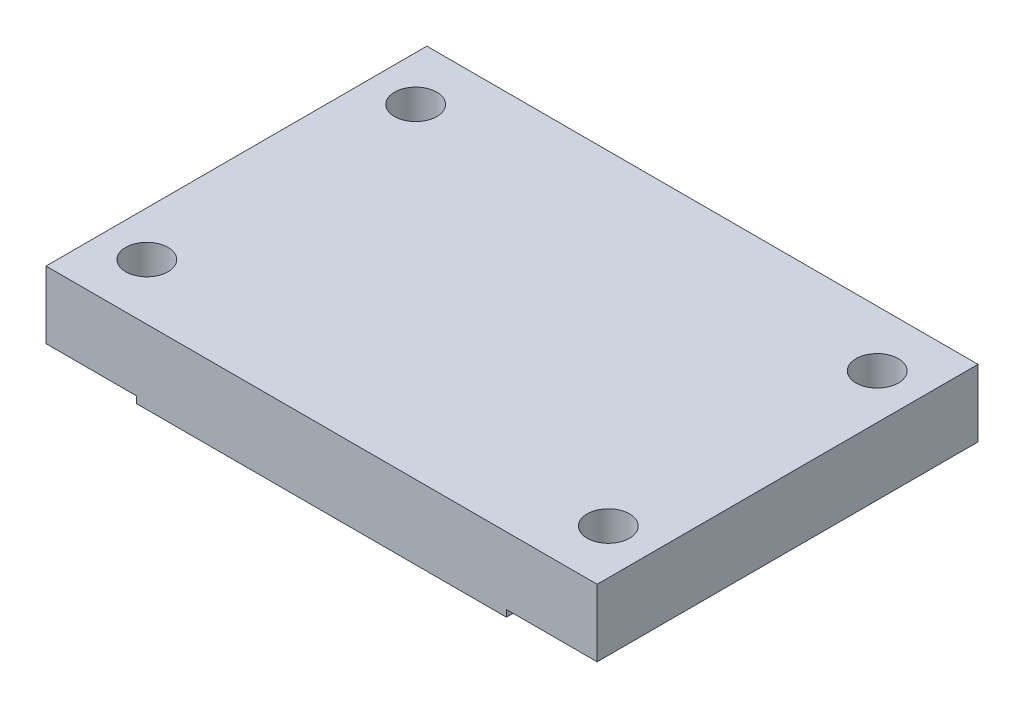
ISO-10303-21;
HEADER;
FILE_DESCRIPTION(('STEP AP214'),'2;1');
FILE_NAME('part.step','',(''),(''),'','','');
FILE_SCHEMA(('AUTOMOTIVE_DESIGN { 1 0 10303 214 1 1 1 1 }'));
ENDSEC;
DATA;
#1=APPLICATION_CONTEXT('core data for automotive mechanical design processes');
#2=APPLICATION_PROTOCOL_DEFINITION('international standard','automotive_design',2000,#1);
#3=PRODUCT_CONTEXT('',#1,'mechanical');
#4=PRODUCT('Part','Part','',(#3));
#5=PRODUCT_RELATED_PRODUCT_CATEGORY('part','',(#4));
#6=PRODUCT_DEFINITION_FORMATION('','',#4);
#7=PRODUCT_DEFINITION_CONTEXT('part definition',#1,'design');
#8=PRODUCT_DEFINITION('design','',#6,#7);
#9=PRODUCT_DEFINITION_SHAPE('','',#8);
#10=(LENGTH_UNIT() NAMED_UNIT(*) SI_UNIT(.MILLI.,.METRE.));
#11=(NAMED_UNIT(*) PLANE_ANGLE_UNIT() SI_UNIT($,.RADIAN.));
#12=(NAMED_UNIT(*) SI_UNIT($,.STERADIAN.) SOLID_ANGLE_UNIT());
#13=UNCERTAINTY_MEASURE_WITH_UNIT(LENGTH_MEASURE(1.E-05),#10,'distance_accuracy_value','');
#14=(GEOMETRIC_REPRESENTATION_CONTEXT(3) GLOBAL_UNCERTAINTY_ASSIGNED_CONTEXT((#13)) GLOBAL_UNIT_ASSIGNED_CONTEXT((#10,
#11,#12)) REPRESENTATION_CONTEXT('',''));
#15=CARTESIAN_POINT('',(0.,0.,0.));
#16=DIRECTION('',(0.,0.,1.));
#17=DIRECTION('',(1.,0.,0.));
#18=AXIS2_PLACEMENT_3D('',#15,#16,#17);
#19=CARTESIAN_POINT('',(0.,7.62,0.));
#20=DIRECTION('',(0.,-1.,0.));
#21=DIRECTION('',(0.,0.,-1.));
#22=AXIS2_PLACEMENT_3D('',#19,#20,#21);
#23=PLANE('',#22);
#24=DIRECTION('',(0.,0.,-1.));
#25=VECTOR('',#24,1.);
#26=CARTESIAN_POINT('',(31.242,7.62,21.5037006243539));
#27=LINE('',#26,#25);
#28=CARTESIAN_POINT('',(31.242,7.62,21.5037006243539));
#29=VERTEX_POINT('',#28);
#30=CARTESIAN_POINT('',(31.242,7.62,-21.6762993756461));
#31=VERTEX_POINT('',#30);
#32=EDGE_CURVE('E176',#29,#31,#27,.T.);
#33=ORIENTED_EDGE('',*,*,#32,.T.);
#34=DIRECTION('',(-1.,0.,0.));
#35=VECTOR('',#34,1.);
#36=CARTESIAN_POINT('',(-31.242,7.62,-21.6762993756461));
#37=LINE('',#36,#35);
#38=CARTESIAN_POINT('',(-31.242,7.62,-21.6762993756461));
#39=VERTEX_POINT('',#38);
#40=EDGE_CURVE('E180',#31,#39,#37,.T.);
#41=ORIENTED_EDGE('',*,*,#40,.T.);
#42=DIRECTION('',(0.,0.,1.));
#43=VECTOR('',#42,1.);
#44=CARTESIAN_POINT('',(-31.242,7.62,21.5037006243539));
#45=LINE('',#44,#43);
#46=CARTESIAN_POINT('',(-31.242,7.62,21.5037006243539));
#47=VERTEX_POINT('',#46);
#48=EDGE_CURVE('E184',#39,#47,#45,.T.);
#49=ORIENTED_EDGE('',*,*,#48,.T.);
#50=DIRECTION('',(1.,0.,0.));
#51=VECTOR('',#50,1.);
#52=CARTESIAN_POINT('',(-31.242,7.62,21.5037006243539));
#53=LINE('',#52,#51);
#54=EDGE_CURVE('E187',#47,#29,#53,.T.);
#55=ORIENTED_EDGE('',*,*,#54,.T.);
#56=EDGE_LOOP('',(#33,#41,#49,#55));
#57=FACE_BOUND('',#56,.T.);
#58=CARTESIAN_POINT('',(-26.162,7.62,-15.3262993756461));
#59=DIRECTION('',(0.,1.,0.));
#60=DIRECTION('',(0.,0.,1.));
#61=AXIS2_PLACEMENT_3D('',#58,#59,#60);
#62=CIRCLE('',#61,2.4003);
#63=CARTESIAN_POINT('',(-26.162,7.62,-17.7265993756461));
#64=VERTEX_POINT('',#63);
#65=EDGE_CURVE('E168',#64,#64,#62,.T.);
#66=ORIENTED_EDGE('',*,*,#65,.F.);
#67=EDGE_LOOP('',(#66));
#68=FACE_BOUND('',#67,.T.);
#69=CARTESIAN_POINT('',(-26.162,7.62,15.1537006243539));
#70=DIRECTION('',(0.,1.,0.));
#71=DIRECTION('',(0.,0.,1.));
#72=AXIS2_PLACEMENT_3D('',#69,#70,#71);
#73=CIRCLE('',#72,2.4003);
#74=CARTESIAN_POINT('',(-26.162,7.62,12.7534006243539));
#75=VERTEX_POINT('',#74);
#76=EDGE_CURVE('E160',#75,#75,#73,.T.);
#77=ORIENTED_EDGE('',*,*,#76,.F.);
#78=EDGE_LOOP('',(#77));
#79=FACE_BOUND('',#78,.T.);
#80=CARTESIAN_POINT('',(26.162,7.62,15.1537006243539));
#81=DIRECTION('',(0.,1.,0.));
#82=DIRECTION('',(0.,0.,-1.));
#83=AXIS2_PLACEMENT_3D('',#80,#81,#82);
#84=CIRCLE('',#83,2.4003);
#85=CARTESIAN_POINT('',(26.162,7.62,12.7534006243539));
#86=VERTEX_POINT('',#85);
#87=EDGE_CURVE('E152',#86,#86,#84,.T.);
#88=ORIENTED_EDGE('',*,*,#87,.F.);
#89=EDGE_LOOP('',(#88));
#90=FACE_BOUND('',#89,.T.);
#91=CARTESIAN_POINT('',(26.162,7.62,-15.3262993756461));
#92=DIRECTION('',(0.,1.,0.));
#93=DIRECTION('',(0.,0.,-1.));
#94=AXIS2_PLACEMENT_3D('',#91,#92,#93);
#95=CIRCLE('',#94,2.4003);
#96=CARTESIAN_POINT('',(26.162,7.62,-17.7265993756461));
#97=VERTEX_POINT('',#96);
#98=EDGE_CURVE('E142',#97,#97,#95,.T.);
#99=ORIENTED_EDGE('',*,*,#98,.F.);
#100=EDGE_LOOP('',(#99));
#101=FACE_BOUND('',#100,.T.);
#102=ADVANCED_FACE('F47',(#57,#68,#79,#90,#101),#23,.F.);
#103=CARTESIAN_POINT('',(0.,0.,0.));
#104=DIRECTION('',(0.,-1.,0.));
#105=DIRECTION('',(0.,0.,-1.));
#106=AXIS2_PLACEMENT_3D('',#103,#104,#105);
#107=PLANE('',#106);
#108=DIRECTION('',(0.,0.,1.));
#109=VECTOR('',#108,1.);
#110=CARTESIAN_POINT('',(20.955,0.,-21.5037006243539));
#111=LINE('',#110,#109);
#112=CARTESIAN_POINT('',(20.955,0.,-21.5037006243539));
#113=VERTEX_POINT('',#112);
#114=CARTESIAN_POINT('',(20.955,0.,21.5037006243539));
#115=VERTEX_POINT('',#114);
#116=EDGE_CURVE('E63',#113,#115,#111,.T.);
#117=ORIENTED_EDGE('',*,*,#116,.F.);
#118=DIRECTION('',(1.,0.,0.));
#119=VECTOR('',#118,1.);
#120=CARTESIAN_POINT('',(-20.955,0.,-21.5037006243539));
#121=LINE('',#120,#119);
#122=CARTESIAN_POINT('',(-20.955,0.,-21.5037006243539));
#123=VERTEX_POINT('',#122);
#124=EDGE_CURVE('E133',#123,#113,#121,.T.);
#125=ORIENTED_EDGE('',*,*,#124,.F.);
#126=DIRECTION('',(0.,0.,-1.));
#127=VECTOR('',#126,1.);
#128=CARTESIAN_POINT('',(-20.955,0.,-21.5037006243539));
#129=LINE('',#128,#127);
#130=CARTESIAN_POINT('',(-20.955,0.,21.5037006243539));
#131=VERTEX_POINT('',#130);
#132=EDGE_CURVE('E221',#131,#123,#129,.T.);
#133=ORIENTED_EDGE('',*,*,#132,.F.);
#134=DIRECTION('',(1.,0.,0.));
#135=VECTOR('',#134,1.);
#136=CARTESIAN_POINT('',(-31.242,0.,21.5037006243539));
#137=LINE('',#136,#135);
#138=CARTESIAN_POINT('',(-31.242,0.,21.5037006243539));
#139=VERTEX_POINT('',#138);
#140=EDGE_CURVE('E181',#139,#131,#137,.T.);
#141=ORIENTED_EDGE('',*,*,#140,.F.);
#142=DIRECTION('',(0.,0.,1.));
#143=VECTOR('',#142,1.);
#144=CARTESIAN_POINT('',(-31.242,0.,21.5037006243539));
#145=LINE('',#144,#143);
#146=CARTESIAN_POINT('',(-31.242,0.,-21.6762993756461));
#147=VERTEX_POINT('',#146);
#148=EDGE_CURVE('E197',#147,#139,#145,.T.);
#149=ORIENTED_EDGE('',*,*,#148,.F.);
#150=DIRECTION('',(-1.,0.,0.));
#151=VECTOR('',#150,1.);
#152=CARTESIAN_POINT('',(-31.242,0.,-21.6762993756461));
#153=LINE('',#152,#151);
#154=CARTESIAN_POINT('',(31.242,0.,-21.6762993756461));
#155=VERTEX_POINT('',#154);
#156=EDGE_CURVE('E194',#155,#147,#153,.T.);
#157=ORIENTED_EDGE('',*,*,#156,.F.);
#158=DIRECTION('',(0.,0.,-1.));
#159=VECTOR('',#158,1.);
#160=CARTESIAN_POINT('',(31.242,0.,21.5037006243539));
#161=LINE('',#160,#159);
#162=CARTESIAN_POINT('',(31.242,0.,21.5037006243539));
#163=VERTEX_POINT('',#162);
#164=EDGE_CURVE('E172',#163,#155,#161,.T.);
#165=ORIENTED_EDGE('',*,*,#164,.F.);
#166=EDGE_CURVE('E68',#115,#163,#137,.T.);
#167=ORIENTED_EDGE('',*,*,#166,.F.);
#168=EDGE_LOOP('',(#117,#125,#133,#141,#149,#157,#165,#167));
#169=FACE_BOUND('',#168,.T.);
#170=CARTESIAN_POINT('',(26.162,0.,15.1537006243539));
#171=DIRECTION('',(0.,1.,0.));
#172=DIRECTION('',(0.,0.,-1.));
#173=AXIS2_PLACEMENT_3D('',#170,#171,#172);
#174=CIRCLE('',#173,2.4003);
#175=CARTESIAN_POINT('',(26.162,0.,12.7534006243539));
#176=VERTEX_POINT('',#175);
#177=EDGE_CURVE('E150',#176,#176,#174,.T.);
#178=ORIENTED_EDGE('',*,*,#177,.T.);
#179=EDGE_LOOP('',(#178));
#180=FACE_BOUND('',#179,.T.);
#181=CARTESIAN_POINT('',(-26.162,0.,-15.3262993756461));
#182=DIRECTION('',(0.,1.,0.));
#183=DIRECTION('',(0.,0.,1.));
#184=AXIS2_PLACEMENT_3D('',#181,#182,#183);
#185=CIRCLE('',#184,2.4003);
#186=CARTESIAN_POINT('',(-26.162,0.,-17.7265993756461));
#187=VERTEX_POINT('',#186);
#188=EDGE_CURVE('E164',#187,#187,#185,.T.);
#189=ORIENTED_EDGE('',*,*,#188,.T.);
#190=EDGE_LOOP('',(#189));
#191=FACE_BOUND('',#190,.T.);
#192=CARTESIAN_POINT('',(-26.162,0.,15.1537006243539));
#193=DIRECTION('',(0.,1.,0.));
#194=DIRECTION('',(0.,0.,1.));
#195=AXIS2_PLACEMENT_3D('',#192,#193,#194);
#196=CIRCLE('',#195,2.4003);
#197=CARTESIAN_POINT('',(-26.162,0.,12.7534006243539));
#198=VERTEX_POINT('',#197);
#199=EDGE_CURVE('E156',#198,#198,#196,.T.);
#200=ORIENTED_EDGE('',*,*,#199,.T.);
#201=EDGE_LOOP('',(#200));
#202=FACE_BOUND('',#201,.T.);
#203=CARTESIAN_POINT('',(26.162,0.,-15.3262993756461));
#204=DIRECTION('',(0.,1.,0.));
#205=DIRECTION('',(0.,0.,-1.));
#206=AXIS2_PLACEMENT_3D('',#203,#204,#205);
#207=CIRCLE('',#206,2.4003);
#208=CARTESIAN_POINT('',(26.162,0.,-17.7265993756461));
#209=VERTEX_POINT('',#208);
#210=EDGE_CURVE('E137',#209,#209,#207,.T.);
#211=ORIENTED_EDGE('',*,*,#210,.T.);
#212=EDGE_LOOP('',(#211));
#213=FACE_BOUND('',#212,.T.);
#214=ADVANCED_FACE('F218',(#169,#180,#191,#202,#213),#107,.T.);
#215=CARTESIAN_POINT('',(31.242,7.62,21.5037006243539));
#216=DIRECTION('',(-1.,0.,0.));
#217=DIRECTION('',(0.,0.,1.));
#218=AXIS2_PLACEMENT_3D('',#215,#216,#217);
#219=PLANE('',#218);
#220=ORIENTED_EDGE('',*,*,#164,.T.);
#221=DIRECTION('',(0.,-1.,0.));
#222=VECTOR('',#221,1.);
#223=CARTESIAN_POINT('',(31.242,7.62,-21.6762993756461));
#224=LINE('',#223,#222);
#225=EDGE_CURVE('E11',#31,#155,#224,.T.);
#226=ORIENTED_EDGE('',*,*,#225,.F.);
#227=ORIENTED_EDGE('',*,*,#32,.F.);
#228=DIRECTION('',(0.,-1.,0.));
#229=VECTOR('',#228,1.);
#230=CARTESIAN_POINT('',(31.242,7.62,21.5037006243539));
#231=LINE('',#230,#229);
#232=EDGE_CURVE('E190',#29,#163,#231,.T.);
#233=ORIENTED_EDGE('',*,*,#232,.T.);
#234=EDGE_LOOP('',(#220,#226,#227,#233));
#235=FACE_BOUND('',#234,.T.);
#236=ADVANCED_FACE('F49',(#235),#219,.F.);
#237=CARTESIAN_POINT('',(-31.242,7.62,-21.6762993756461));
#238=DIRECTION('',(0.,0.,1.));
#239=DIRECTION('',(1.,0.,0.));
#240=AXIS2_PLACEMENT_3D('',#237,#238,#239);
#241=PLANE('',#240);
#242=ORIENTED_EDGE('',*,*,#156,.T.);
#243=DIRECTION('',(0.,-1.,0.));
#244=VECTOR('',#243,1.);
#245=CARTESIAN_POINT('',(-31.242,7.62,-21.6762993756461));
#246=LINE('',#245,#244);
#247=EDGE_CURVE('E56',#39,#147,#246,.T.);
#248=ORIENTED_EDGE('',*,*,#247,.F.);
#249=ORIENTED_EDGE('',*,*,#40,.F.);
#250=ORIENTED_EDGE('',*,*,#225,.T.);
#251=EDGE_LOOP('',(#242,#248,#249,#250));
#252=FACE_BOUND('',#251,.T.);
#253=ADVANCED_FACE('F267',(#252),#241,.F.);
#254=CARTESIAN_POINT('',(-31.242,7.62,21.5037006243539));
#255=DIRECTION('',(1.,0.,0.));
#256=DIRECTION('',(0.,0.,-1.));
#257=AXIS2_PLACEMENT_3D('',#254,#255,#256);
#258=PLANE('',#257);
#259=ORIENTED_EDGE('',*,*,#148,.T.);
#260=DIRECTION('',(0.,-1.,0.));
#261=VECTOR('',#260,1.);
#262=CARTESIAN_POINT('',(-31.242,7.62,21.5037006243539));
#263=LINE('',#262,#261);
#264=EDGE_CURVE('E205',#47,#139,#263,.T.);
#265=ORIENTED_EDGE('',*,*,#264,.F.);
#266=ORIENTED_EDGE('',*,*,#48,.F.);
#267=ORIENTED_EDGE('',*,*,#247,.T.);
#268=EDGE_LOOP('',(#259,#265,#266,#267));
#269=FACE_BOUND('',#268,.T.);
#270=ADVANCED_FACE('F214',(#269),#258,.F.);
#271=CARTESIAN_POINT('',(-31.242,7.62,21.5037006243539));
#272=DIRECTION('',(0.,0.,-1.));
#273=DIRECTION('',(-1.,0.,0.));
#274=AXIS2_PLACEMENT_3D('',#271,#272,#273);
#275=PLANE('',#274);
#276=ORIENTED_EDGE('',*,*,#140,.T.);
#277=DIRECTION('',(0.,1.,0.));
#278=VECTOR('',#277,1.);
#279=CARTESIAN_POINT('',(-20.955,-0.762,21.5037006243539));
#280=LINE('',#279,#278);
#281=CARTESIAN_POINT('',(-20.955,-0.762,21.5037006243539));
#282=VERTEX_POINT('',#281);
#283=EDGE_CURVE('E118',#282,#131,#280,.T.);
#284=ORIENTED_EDGE('',*,*,#283,.F.);
#285=DIRECTION('',(-1.,0.,0.));
#286=VECTOR('',#285,1.);
#287=CARTESIAN_POINT('',(-20.955,-0.762,21.5037006243539));
#288=LINE('',#287,#286);
#289=CARTESIAN_POINT('',(20.955,-0.762,21.5037006243539));
#290=VERTEX_POINT('',#289);
#291=EDGE_CURVE('E111',#290,#282,#288,.T.);
#292=ORIENTED_EDGE('',*,*,#291,.F.);
#293=DIRECTION('',(0.,1.,0.));
#294=VECTOR('',#293,1.);
#295=CARTESIAN_POINT('',(20.955,-0.762,21.5037006243539));
#296=LINE('',#295,#294);
#297=EDGE_CURVE('E116',#290,#115,#296,.T.);
#298=ORIENTED_EDGE('',*,*,#297,.T.);
#299=ORIENTED_EDGE('',*,*,#166,.T.);
#300=ORIENTED_EDGE('',*,*,#232,.F.);
#301=ORIENTED_EDGE('',*,*,#54,.F.);
#302=ORIENTED_EDGE('',*,*,#264,.T.);
#303=EDGE_LOOP('',(#276,#284,#292,#298,#299,#300,#301,#302));
#304=FACE_BOUND('',#303,.T.);
#305=ADVANCED_FACE('F114',(#304),#275,.F.);
#306=CARTESIAN_POINT('',(-26.162,7.62,-15.3262993756461));
#307=DIRECTION('',(0.,-1.,0.));
#308=DIRECTION('',(0.,0.,-1.));
#309=AXIS2_PLACEMENT_3D('',#306,#307,#308);
#310=CYLINDRICAL_SURFACE('',#309,2.4003);
#311=CARTESIAN_POINT('',(-26.162,7.62,-17.7265993756461));
#312=CARTESIAN_POINT('',(-26.162,7.540625,-17.7265993756461));
#313=CARTESIAN_POINT('',(-26.162,7.46125,-17.7265993756461));
#314=CARTESIAN_POINT('',(-26.162,7.3025,-17.7265993756461));
#315=CARTESIAN_POINT('',(-26.162,7.223125,-17.7265993756461));
#316=CARTESIAN_POINT('',(-26.162,7.064375,-17.7265993756461));
#317=CARTESIAN_POINT('',(-26.162,6.985,-17.7265993756461));
#318=CARTESIAN_POINT('',(-26.162,6.82625,-17.7265993756461));
#319=CARTESIAN_POINT('',(-26.162,6.746875,-17.7265993756461));
#320=CARTESIAN_POINT('',(-26.162,6.588125,-17.7265993756461));
#321=CARTESIAN_POINT('',(-26.162,6.50875,-17.7265993756461));
#322=CARTESIAN_POINT('',(-26.162,6.35,-17.7265993756461));
#323=CARTESIAN_POINT('',(-26.162,6.270625,-17.7265993756461));
#324=CARTESIAN_POINT('',(-26.162,6.111875,-17.7265993756461));
#325=CARTESIAN_POINT('',(-26.162,6.0325,-17.7265993756461));
#326=CARTESIAN_POINT('',(-26.162,5.87375,-17.7265993756461));
#327=CARTESIAN_POINT('',(-26.162,5.794375,-17.7265993756461));
#328=CARTESIAN_POINT('',(-26.162,5.635625,-17.7265993756461));
#329=CARTESIAN_POINT('',(-26.162,5.55625,-17.7265993756461));
#330=CARTESIAN_POINT('',(-26.162,5.3975,-17.7265993756461));
#331=CARTESIAN_POINT('',(-26.162,5.318125,-17.7265993756461));
#332=CARTESIAN_POINT('',(-26.162,5.159375,-17.7265993756461));
#333=CARTESIAN_POINT('',(-26.162,5.08,-17.7265993756461));
#334=CARTESIAN_POINT('',(-26.162,4.92125,-17.7265993756461));
#335=CARTESIAN_POINT('',(-26.162,4.841875,-17.7265993756461));
#336=CARTESIAN_POINT('',(-26.162,4.683125,-17.7265993756461));
#337=CARTESIAN_POINT('',(-26.162,4.60375,-17.7265993756461));
#338=CARTESIAN_POINT('',(-26.162,4.445,-17.7265993756461));
#339=CARTESIAN_POINT('',(-26.162,4.365625,-17.7265993756461));
#340=CARTESIAN_POINT('',(-26.162,4.206875,-17.7265993756461));
#341=CARTESIAN_POINT('',(-26.162,4.1275,-17.7265993756461));
#342=CARTESIAN_POINT('',(-26.162,3.96875,-17.7265993756461));
#343=CARTESIAN_POINT('',(-26.162,3.889375,-17.7265993756461));
#344=CARTESIAN_POINT('',(-26.162,3.730625,-17.7265993756461));
#345=CARTESIAN_POINT('',(-26.162,3.65125,-17.7265993756461));
#346=CARTESIAN_POINT('',(-26.162,3.4925,-17.7265993756461));
#347=CARTESIAN_POINT('',(-26.162,3.413125,-17.7265993756461));
#348=CARTESIAN_POINT('',(-26.162,3.254375,-17.7265993756461));
#349=CARTESIAN_POINT('',(-26.162,3.175,-17.7265993756461));
#350=CARTESIAN_POINT('',(-26.162,3.01625,-17.7265993756461));
#351=CARTESIAN_POINT('',(-26.162,2.936875,-17.7265993756461));
#352=CARTESIAN_POINT('',(-26.162,2.778125,-17.7265993756461));
#353=CARTESIAN_POINT('',(-26.162,2.69875,-17.7265993756461));
#354=CARTESIAN_POINT('',(-26.162,2.54,-17.7265993756461));
#355=CARTESIAN_POINT('',(-26.162,2.460625,-17.7265993756461));
#356=CARTESIAN_POINT('',(-26.162,2.301875,-17.7265993756461));
#357=CARTESIAN_POINT('',(-26.162,2.2225,-17.7265993756461));
#358=CARTESIAN_POINT('',(-26.162,2.06375,-17.7265993756461));
#359=CARTESIAN_POINT('',(-26.162,1.984375,-17.7265993756461));
#360=CARTESIAN_POINT('',(-26.162,1.825625,-17.7265993756461));
#361=CARTESIAN_POINT('',(-26.162,1.74625,-17.7265993756461));
#362=CARTESIAN_POINT('',(-26.162,1.5875,-17.7265993756461));
#363=CARTESIAN_POINT('',(-26.162,1.508125,-17.7265993756461));
#364=CARTESIAN_POINT('',(-26.162,1.349375,-17.7265993756461));
#365=CARTESIAN_POINT('',(-26.162,1.27,-17.7265993756461));
#366=CARTESIAN_POINT('',(-26.162,1.11125,-17.7265993756461));
#367=CARTESIAN_POINT('',(-26.162,1.031875,-17.7265993756461));
#368=CARTESIAN_POINT('',(-26.162,0.873125,-17.7265993756461));
#369=CARTESIAN_POINT('',(-26.162,0.79375,-17.7265993756461));
#370=CARTESIAN_POINT('',(-26.162,0.635,-17.7265993756461));
#371=CARTESIAN_POINT('',(-26.162,0.555625,-17.7265993756461));
#372=CARTESIAN_POINT('',(-26.162,0.396875,-17.7265993756461));
#373=CARTESIAN_POINT('',(-26.162,0.3175,-17.7265993756461));
#374=CARTESIAN_POINT('',(-26.162,0.15875,-17.7265993756461));
#375=CARTESIAN_POINT('',(-26.162,0.0793749999999999,-17.7265993756461));
#376=CARTESIAN_POINT('',(-26.162,0.,-17.7265993756461));
#377=B_SPLINE_CURVE_WITH_KNOTS('',3,(#311,#312,#313,#314,#315,#316,#317,#318,#319,#320,#321,
#322,#323,#324,#325,#326,#327,#328,#329,#330,#331,#332,#333,#334,#335,#336,#337,#338,#339,#340,
#341,#342,#343,#344,#345,#346,#347,#348,#349,#350,#351,#352,#353,#354,#355,#356,#357,#358,#359,
#360,#361,#362,#363,#364,#365,#366,#367,#368,#369,#370,#371,#372,#373,#374,#375,#376),
.UNSPECIFIED.,.F.,.F.,(4,2,2,2,2,2,2,2,2,2,2,2,2,2,2,2,2,2,2,2,2,2,2,2,2,2,2,2,2,2,2,2,4),(0.,
0.238125,0.47625,0.714375000000001,0.9525,1.190625,1.42875,1.666875,1.905,2.143125,2.38125,
2.619375,2.8575,3.095625,3.33375,3.571875,3.81,4.048125,4.28625,4.524375,4.7625,5.000625,
5.23875,5.476875,5.715,5.953125,6.19125,6.429375,6.6675,6.905625,7.14375,7.381875,7.62),.UNSPECIFIED.);
#378=EDGE_CURVE('BSEAM261',#64,#187,#377,.T.);
#379=ORIENTED_EDGE('',*,*,#65,.T.);
#380=ORIENTED_EDGE('',*,*,#188,.F.);
#381=ORIENTED_EDGE('',*,*,#378,.T.);
#382=ORIENTED_EDGE('',*,*,#378,.F.);
#383=EDGE_LOOP('',(#379,#381,#380,#382));
#384=FACE_BOUND('',#383,.T.);
#385=ADVANCED_FACE('F261',(#384),#310,.F.);
#386=CARTESIAN_POINT('',(-26.162,7.62,15.1537006243539));
#387=DIRECTION('',(0.,-1.,0.));
#388=DIRECTION('',(0.,0.,-1.));
#389=AXIS2_PLACEMENT_3D('',#386,#387,#388);
#390=CYLINDRICAL_SURFACE('',#389,2.4003);
#391=CARTESIAN_POINT('',(-26.162,7.62,12.7534006243539));
#392=CARTESIAN_POINT('',(-26.162,7.540625,12.7534006243539));
#393=CARTESIAN_POINT('',(-26.162,7.46125,12.7534006243539));
#394=CARTESIAN_POINT('',(-26.162,7.3025,12.7534006243539));
#395=CARTESIAN_POINT('',(-26.162,7.223125,12.7534006243539));
#396=CARTESIAN_POINT('',(-26.162,7.064375,12.7534006243539));
#397=CARTESIAN_POINT('',(-26.162,6.985,12.7534006243539));
#398=CARTESIAN_POINT('',(-26.162,6.82625,12.7534006243539));
#399=CARTESIAN_POINT('',(-26.162,6.746875,12.7534006243539));
#400=CARTESIAN_POINT('',(-26.162,6.588125,12.7534006243539));
#401=CARTESIAN_POINT('',(-26.162,6.50875,12.7534006243539));
#402=CARTESIAN_POINT('',(-26.162,6.35,12.7534006243539));
#403=CARTESIAN_POINT('',(-26.162,6.270625,12.7534006243539));
#404=CARTESIAN_POINT('',(-26.162,6.111875,12.7534006243539));
#405=CARTESIAN_POINT('',(-26.162,6.0325,12.7534006243539));
#406=CARTESIAN_POINT('',(-26.162,5.87375,12.7534006243539));
#407=CARTESIAN_POINT('',(-26.162,5.794375,12.7534006243539));
#408=CARTESIAN_POINT('',(-26.162,5.635625,12.7534006243539));
#409=CARTESIAN_POINT('',(-26.162,5.55625,12.7534006243539));
#410=CARTESIAN_POINT('',(-26.162,5.3975,12.7534006243539));
#411=CARTESIAN_POINT('',(-26.162,5.318125,12.7534006243539));
#412=CARTESIAN_POINT('',(-26.162,5.159375,12.7534006243539));
#413=CARTESIAN_POINT('',(-26.162,5.08,12.7534006243539));
#414=CARTESIAN_POINT('',(-26.162,4.92125,12.7534006243539));
#415=CARTESIAN_POINT('',(-26.162,4.841875,12.7534006243539));
#416=CARTESIAN_POINT('',(-26.162,4.683125,12.7534006243539));
#417=CARTESIAN_POINT('',(-26.162,4.60375,12.7534006243539));
#418=CARTESIAN_POINT('',(-26.162,4.445,12.7534006243539));
#419=CARTESIAN_POINT('',(-26.162,4.365625,12.7534006243539));
#420=CARTESIAN_POINT('',(-26.162,4.206875,12.7534006243539));
#421=CARTESIAN_POINT('',(-26.162,4.1275,12.7534006243539));
#422=CARTESIAN_POINT('',(-26.162,3.96875,12.7534006243539));
#423=CARTESIAN_POINT('',(-26.162,3.889375,12.7534006243539));
#424=CARTESIAN_POINT('',(-26.162,3.730625,12.7534006243539));
#425=CARTESIAN_POINT('',(-26.162,3.65125,12.7534006243539));
#426=CARTESIAN_POINT('',(-26.162,3.4925,12.7534006243539));
#427=CARTESIAN_POINT('',(-26.162,3.413125,12.7534006243539));
#428=CARTESIAN_POINT('',(-26.162,3.254375,12.7534006243539));
#429=CARTESIAN_POINT('',(-26.162,3.175,12.7534006243539));
#430=CARTESIAN_POINT('',(-26.162,3.01625,12.7534006243539));
#431=CARTESIAN_POINT('',(-26.162,2.936875,12.7534006243539));
#432=CARTESIAN_POINT('',(-26.162,2.778125,12.7534006243539));
#433=CARTESIAN_POINT('',(-26.162,2.69875,12.7534006243539));
#434=CARTESIAN_POINT('',(-26.162,2.54,12.7534006243539));
#435=CARTESIAN_POINT('',(-26.162,2.460625,12.7534006243539));
#436=CARTESIAN_POINT('',(-26.162,2.301875,12.7534006243539));
#437=CARTESIAN_POINT('',(-26.162,2.2225,12.7534006243539));
#438=CARTESIAN_POINT('',(-26.162,2.06375,12.7534006243539));
#439=CARTESIAN_POINT('',(-26.162,1.984375,12.7534006243539));
#440=CARTESIAN_POINT('',(-26.162,1.825625,12.7534006243539));
#441=CARTESIAN_POINT('',(-26.162,1.74625,12.7534006243539));
#442=CARTESIAN_POINT('',(-26.162,1.5875,12.7534006243539));
#443=CARTESIAN_POINT('',(-26.162,1.508125,12.7534006243539));
#444=CARTESIAN_POINT('',(-26.162,1.349375,12.7534006243539));
#445=CARTESIAN_POINT('',(-26.162,1.27,12.7534006243539));
#446=CARTESIAN_POINT('',(-26.162,1.11125,12.7534006243539));
#447=CARTESIAN_POINT('',(-26.162,1.031875,12.7534006243539));
#448=CARTESIAN_POINT('',(-26.162,0.873125,12.7534006243539));
#449=CARTESIAN_POINT('',(-26.162,0.79375,12.7534006243539));
#450=CARTESIAN_POINT('',(-26.162,0.635,12.7534006243539));
#451=CARTESIAN_POINT('',(-26.162,0.555625,12.7534006243539));
#452=CARTESIAN_POINT('',(-26.162,0.396875,12.7534006243539));
#453=CARTESIAN_POINT('',(-26.162,0.3175,12.7534006243539));
#454=CARTESIAN_POINT('',(-26.162,0.15875,12.7534006243539));
#455=CARTESIAN_POINT('',(-26.162,0.0793749999999999,12.7534006243539));
#456=CARTESIAN_POINT('',(-26.162,0.,12.7534006243539));
#457=B_SPLINE_CURVE_WITH_KNOTS('',3,(#391,#392,#393,#394,#395,#396,#397,#398,#399,#400,#401,
#402,#403,#404,#405,#406,#407,#408,#409,#410,#411,#412,#413,#414,#415,#416,#417,#418,#419,#420,
#421,#422,#423,#424,#425,#426,#427,#428,#429,#430,#431,#432,#433,#434,#435,#436,#437,#438,#439,
#440,#441,#442,#443,#444,#445,#446,#447,#448,#449,#450,#451,#452,#453,#454,#455,#456),
.UNSPECIFIED.,.F.,.F.,(4,2,2,2,2,2,2,2,2,2,2,2,2,2,2,2,2,2,2,2,2,2,2,2,2,2,2,2,2,2,2,2,4),(0.,
0.238125,0.47625,0.714375000000001,0.9525,1.190625,1.42875,1.666875,1.905,2.143125,2.38125,
2.619375,2.8575,3.095625,3.33375,3.571875,3.81,4.048125,4.28625,4.524375,4.7625,5.000625,
5.23875,5.476875,5.715,5.953125,6.19125,6.429375,6.6675,6.905625,7.14375,7.381875,7.62),.UNSPECIFIED.);
#458=EDGE_CURVE('BSEAM312',#75,#198,#457,.T.);
#459=ORIENTED_EDGE('',*,*,#76,.T.);
#460=ORIENTED_EDGE('',*,*,#199,.F.);
#461=ORIENTED_EDGE('',*,*,#458,.T.);
#462=ORIENTED_EDGE('',*,*,#458,.F.);
#463=EDGE_LOOP('',(#459,#461,#460,#462));
#464=FACE_BOUND('',#463,.T.);
#465=ADVANCED_FACE('F312',(#464),#390,.F.);
#466=CARTESIAN_POINT('',(26.162,7.62,15.1537006243539));
#467=DIRECTION('',(0.,-1.,0.));
#468=DIRECTION('',(0.,0.,-1.));
#469=AXIS2_PLACEMENT_3D('',#466,#467,#468);
#470=CYLINDRICAL_SURFACE('',#469,2.4003);
#471=CARTESIAN_POINT('',(26.162,7.62,12.7534006243539));
#472=CARTESIAN_POINT('',(26.162,7.540625,12.7534006243539));
#473=CARTESIAN_POINT('',(26.162,7.46125,12.7534006243539));
#474=CARTESIAN_POINT('',(26.162,7.3025,12.7534006243539));
#475=CARTESIAN_POINT('',(26.162,7.223125,12.7534006243539));
#476=CARTESIAN_POINT('',(26.162,7.064375,12.7534006243539));
#477=CARTESIAN_POINT('',(26.162,6.985,12.7534006243539));
#478=CARTESIAN_POINT('',(26.162,6.82625,12.7534006243539));
#479=CARTESIAN_POINT('',(26.162,6.746875,12.7534006243539));
#480=CARTESIAN_POINT('',(26.162,6.588125,12.7534006243539));
#481=CARTESIAN_POINT('',(26.162,6.50875,12.7534006243539));
#482=CARTESIAN_POINT('',(26.162,6.35,12.7534006243539));
#483=CARTESIAN_POINT('',(26.162,6.270625,12.7534006243539));
#484=CARTESIAN_POINT('',(26.162,6.111875,12.7534006243539));
#485=CARTESIAN_POINT('',(26.162,6.0325,12.7534006243539));
#486=CARTESIAN_POINT('',(26.162,5.87375,12.7534006243539));
#487=CARTESIAN_POINT('',(26.162,5.794375,12.7534006243539));
#488=CARTESIAN_POINT('',(26.162,5.635625,12.7534006243539));
#489=CARTESIAN_POINT('',(26.162,5.55625,12.7534006243539));
#490=CARTESIAN_POINT('',(26.162,5.3975,12.7534006243539));
#491=CARTESIAN_POINT('',(26.162,5.318125,12.7534006243539));
#492=CARTESIAN_POINT('',(26.162,5.159375,12.7534006243539));
#493=CARTESIAN_POINT('',(26.162,5.08,12.7534006243539));
#494=CARTESIAN_POINT('',(26.162,4.92125,12.7534006243539));
#495=CARTESIAN_POINT('',(26.162,4.841875,12.7534006243539));
#496=CARTESIAN_POINT('',(26.162,4.683125,12.7534006243539));
#497=CARTESIAN_POINT('',(26.162,4.60375,12.7534006243539));
#498=CARTESIAN_POINT('',(26.162,4.445,12.7534006243539));
#499=CARTESIAN_POINT('',(26.162,4.365625,12.7534006243539));
#500=CARTESIAN_POINT('',(26.162,4.206875,12.7534006243539));
#501=CARTESIAN_POINT('',(26.162,4.1275,12.7534006243539));
#502=CARTESIAN_POINT('',(26.162,3.96875,12.7534006243539));
#503=CARTESIAN_POINT('',(26.162,3.889375,12.7534006243539));
#504=CARTESIAN_POINT('',(26.162,3.730625,12.7534006243539));
#505=CARTESIAN_POINT('',(26.162,3.65125,12.7534006243539));
#506=CARTESIAN_POINT('',(26.162,3.4925,12.7534006243539));
#507=CARTESIAN_POINT('',(26.162,3.413125,12.7534006243539));
#508=CARTESIAN_POINT('',(26.162,3.254375,12.7534006243539));
#509=CARTESIAN_POINT('',(26.162,3.175,12.7534006243539));
#510=CARTESIAN_POINT('',(26.162,3.01625,12.7534006243539));
#511=CARTESIAN_POINT('',(26.162,2.936875,12.7534006243539));
#512=CARTESIAN_POINT('',(26.162,2.778125,12.7534006243539));
#513=CARTESIAN_POINT('',(26.162,2.69875,12.7534006243539));
#514=CARTESIAN_POINT('',(26.162,2.54,12.7534006243539));
#515=CARTESIAN_POINT('',(26.162,2.460625,12.7534006243539));
#516=CARTESIAN_POINT('',(26.162,2.301875,12.7534006243539));
#517=CARTESIAN_POINT('',(26.162,2.2225,12.7534006243539));
#518=CARTESIAN_POINT('',(26.162,2.06375,12.7534006243539));
#519=CARTESIAN_POINT('',(26.162,1.984375,12.7534006243539));
#520=CARTESIAN_POINT('',(26.162,1.825625,12.7534006243539));
#521=CARTESIAN_POINT('',(26.162,1.74625,12.7534006243539));
#522=CARTESIAN_POINT('',(26.162,1.5875,12.7534006243539));
#523=CARTESIAN_POINT('',(26.162,1.508125,12.7534006243539));
#524=CARTESIAN_POINT('',(26.162,1.349375,12.7534006243539));
#525=CARTESIAN_POINT('',(26.162,1.27,12.7534006243539));
#526=CARTESIAN_POINT('',(26.162,1.11125,12.7534006243539));
#527=CARTESIAN_POINT('',(26.162,1.031875,12.7534006243539));
#528=CARTESIAN_POINT('',(26.162,0.873125,12.7534006243539));
#529=CARTESIAN_POINT('',(26.162,0.79375,12.7534006243539));
#530=CARTESIAN_POINT('',(26.162,0.635,12.7534006243539));
#531=CARTESIAN_POINT('',(26.162,0.555625,12.7534006243539));
#532=CARTESIAN_POINT('',(26.162,0.396875,12.7534006243539));
#533=CARTESIAN_POINT('',(26.162,0.3175,12.7534006243539));
#534=CARTESIAN_POINT('',(26.162,0.15875,12.7534006243539));
#535=CARTESIAN_POINT('',(26.162,0.0793749999999999,12.7534006243539));
#536=CARTESIAN_POINT('',(26.162,0.,12.7534006243539));
#537=B_SPLINE_CURVE_WITH_KNOTS('',3,(#471,#472,#473,#474,#475,#476,#477,#478,#479,#480,#481,
#482,#483,#484,#485,#486,#487,#488,#489,#490,#491,#492,#493,#494,#495,#496,#497,#498,#499,#500,
#501,#502,#503,#504,#505,#506,#507,#508,#509,#510,#511,#512,#513,#514,#515,#516,#517,#518,#519,
#520,#521,#522,#523,#524,#525,#526,#527,#528,#529,#530,#531,#532,#533,#534,#535,#536),
.UNSPECIFIED.,.F.,.F.,(4,2,2,2,2,2,2,2,2,2,2,2,2,2,2,2,2,2,2,2,2,2,2,2,2,2,2,2,2,2,2,2,4),(0.,
0.238125,0.47625,0.714375000000001,0.9525,1.190625,1.42875,1.666875,1.905,2.143125,2.38125,
2.619375,2.8575,3.095625,3.33375,3.571875,3.81,4.048125,4.28625,4.524375,4.7625,5.000625,
5.23875,5.476875,5.715,5.953125,6.19125,6.429375,6.6675,6.905625,7.14375,7.381875,7.62),.UNSPECIFIED.);
#538=EDGE_CURVE('BSEAM321',#86,#176,#537,.T.);
#539=ORIENTED_EDGE('',*,*,#87,.T.);
#540=ORIENTED_EDGE('',*,*,#177,.F.);
#541=ORIENTED_EDGE('',*,*,#538,.T.);
#542=ORIENTED_EDGE('',*,*,#538,.F.);
#543=EDGE_LOOP('',(#539,#541,#540,#542));
#544=FACE_BOUND('',#543,.T.);
#545=ADVANCED_FACE('F321',(#544),#470,.F.);
#546=CARTESIAN_POINT('',(26.162,7.62,-15.3262993756461));
#547=DIRECTION('',(0.,-1.,0.));
#548=DIRECTION('',(0.,0.,-1.));
#549=AXIS2_PLACEMENT_3D('',#546,#547,#548);
#550=CYLINDRICAL_SURFACE('',#549,2.4003);
#551=CARTESIAN_POINT('',(26.162,7.62,-17.7265993756461));
#552=CARTESIAN_POINT('',(26.162,7.540625,-17.7265993756461));
#553=CARTESIAN_POINT('',(26.162,7.46125,-17.7265993756461));
#554=CARTESIAN_POINT('',(26.162,7.3025,-17.7265993756461));
#555=CARTESIAN_POINT('',(26.162,7.223125,-17.7265993756461));
#556=CARTESIAN_POINT('',(26.162,7.064375,-17.7265993756461));
#557=CARTESIAN_POINT('',(26.162,6.985,-17.7265993756461));
#558=CARTESIAN_POINT('',(26.162,6.82625,-17.7265993756461));
#559=CARTESIAN_POINT('',(26.162,6.746875,-17.7265993756461));
#560=CARTESIAN_POINT('',(26.162,6.588125,-17.7265993756461));
#561=CARTESIAN_POINT('',(26.162,6.50875,-17.7265993756461));
#562=CARTESIAN_POINT('',(26.162,6.35,-17.7265993756461));
#563=CARTESIAN_POINT('',(26.162,6.270625,-17.7265993756461));
#564=CARTESIAN_POINT('',(26.162,6.111875,-17.7265993756461));
#565=CARTESIAN_POINT('',(26.162,6.0325,-17.7265993756461));
#566=CARTESIAN_POINT('',(26.162,5.87375,-17.7265993756461));
#567=CARTESIAN_POINT('',(26.162,5.794375,-17.7265993756461));
#568=CARTESIAN_POINT('',(26.162,5.635625,-17.7265993756461));
#569=CARTESIAN_POINT('',(26.162,5.55625,-17.7265993756461));
#570=CARTESIAN_POINT('',(26.162,5.3975,-17.7265993756461));
#571=CARTESIAN_POINT('',(26.162,5.318125,-17.7265993756461));
#572=CARTESIAN_POINT('',(26.162,5.159375,-17.7265993756461));
#573=CARTESIAN_POINT('',(26.162,5.08,-17.7265993756461));
#574=CARTESIAN_POINT('',(26.162,4.92125,-17.7265993756461));
#575=CARTESIAN_POINT('',(26.162,4.841875,-17.7265993756461));
#576=CARTESIAN_POINT('',(26.162,4.683125,-17.7265993756461));
#577=CARTESIAN_POINT('',(26.162,4.60375,-17.7265993756461));
#578=CARTESIAN_POINT('',(26.162,4.445,-17.7265993756461));
#579=CARTESIAN_POINT('',(26.162,4.365625,-17.7265993756461));
#580=CARTESIAN_POINT('',(26.162,4.206875,-17.7265993756461));
#581=CARTESIAN_POINT('',(26.162,4.1275,-17.7265993756461));
#582=CARTESIAN_POINT('',(26.162,3.96875,-17.7265993756461));
#583=CARTESIAN_POINT('',(26.162,3.889375,-17.7265993756461));
#584=CARTESIAN_POINT('',(26.162,3.730625,-17.7265993756461));
#585=CARTESIAN_POINT('',(26.162,3.65125,-17.7265993756461));
#586=CARTESIAN_POINT('',(26.162,3.4925,-17.7265993756461));
#587=CARTESIAN_POINT('',(26.162,3.413125,-17.7265993756461));
#588=CARTESIAN_POINT('',(26.162,3.254375,-17.7265993756461));
#589=CARTESIAN_POINT('',(26.162,3.175,-17.7265993756461));
#590=CARTESIAN_POINT('',(26.162,3.01625,-17.7265993756461));
#591=CARTESIAN_POINT('',(26.162,2.936875,-17.7265993756461));
#592=CARTESIAN_POINT('',(26.162,2.778125,-17.7265993756461));
#593=CARTESIAN_POINT('',(26.162,2.69875,-17.7265993756461));
#594=CARTESIAN_POINT('',(26.162,2.54,-17.7265993756461));
#595=CARTESIAN_POINT('',(26.162,2.460625,-17.7265993756461));
#596=CARTESIAN_POINT('',(26.162,2.301875,-17.7265993756461));
#597=CARTESIAN_POINT('',(26.162,2.2225,-17.7265993756461));
#598=CARTESIAN_POINT('',(26.162,2.06375,-17.7265993756461));
#599=CARTESIAN_POINT('',(26.162,1.984375,-17.7265993756461));
#600=CARTESIAN_POINT('',(26.162,1.825625,-17.7265993756461));
#601=CARTESIAN_POINT('',(26.162,1.74625,-17.7265993756461));
#602=CARTESIAN_POINT('',(26.162,1.5875,-17.7265993756461));
#603=CARTESIAN_POINT('',(26.162,1.508125,-17.7265993756461));
#604=CARTESIAN_POINT('',(26.162,1.349375,-17.7265993756461));
#605=CARTESIAN_POINT('',(26.162,1.27,-17.7265993756461));
#606=CARTESIAN_POINT('',(26.162,1.11125,-17.7265993756461));
#607=CARTESIAN_POINT('',(26.162,1.031875,-17.7265993756461));
#608=CARTESIAN_POINT('',(26.162,0.873125,-17.7265993756461));
#609=CARTESIAN_POINT('',(26.162,0.79375,-17.7265993756461));
#610=CARTESIAN_POINT('',(26.162,0.635,-17.7265993756461));
#611=CARTESIAN_POINT('',(26.162,0.555625,-17.7265993756461));
#612=CARTESIAN_POINT('',(26.162,0.396875,-17.7265993756461));
#613=CARTESIAN_POINT('',(26.162,0.3175,-17.7265993756461));
#614=CARTESIAN_POINT('',(26.162,0.15875,-17.7265993756461));
#615=CARTESIAN_POINT('',(26.162,0.0793749999999999,-17.7265993756461));
#616=CARTESIAN_POINT('',(26.162,0.,-17.7265993756461));
#617=B_SPLINE_CURVE_WITH_KNOTS('',3,(#551,#552,#553,#554,#555,#556,#557,#558,#559,#560,#561,
#562,#563,#564,#565,#566,#567,#568,#569,#570,#571,#572,#573,#574,#575,#576,#577,#578,#579,#580,
#581,#582,#583,#584,#585,#586,#587,#588,#589,#590,#591,#592,#593,#594,#595,#596,#597,#598,#599,
#600,#601,#602,#603,#604,#605,#606,#607,#608,#609,#610,#611,#612,#613,#614,#615,#616),
.UNSPECIFIED.,.F.,.F.,(4,2,2,2,2,2,2,2,2,2,2,2,2,2,2,2,2,2,2,2,2,2,2,2,2,2,2,2,2,2,2,2,4),(0.,
0.238125,0.47625,0.714375000000001,0.9525,1.190625,1.42875,1.666875,1.905,2.143125,2.38125,
2.619375,2.8575,3.095625,3.33375,3.571875,3.81,4.048125,4.28625,4.524375,4.7625,5.000625,
5.23875,5.476875,5.715,5.953125,6.19125,6.429375,6.6675,6.905625,7.14375,7.381875,7.62),.UNSPECIFIED.);
#618=EDGE_CURVE('BSEAM329',#97,#209,#617,.T.);
#619=ORIENTED_EDGE('',*,*,#98,.T.);
#620=ORIENTED_EDGE('',*,*,#210,.F.);
#621=ORIENTED_EDGE('',*,*,#618,.T.);
#622=ORIENTED_EDGE('',*,*,#618,.F.);
#623=EDGE_LOOP('',(#619,#621,#620,#622));
#624=FACE_BOUND('',#623,.T.);
#625=ADVANCED_FACE('F329',(#624),#550,.F.);
#626=CARTESIAN_POINT('',(20.955,-0.762,-21.5037006243539));
#627=DIRECTION('',(-1.,0.,0.));
#628=DIRECTION('',(0.,0.,1.));
#629=AXIS2_PLACEMENT_3D('',#626,#627,#628);
#630=PLANE('',#629);
#631=ORIENTED_EDGE('',*,*,#116,.T.);
#632=ORIENTED_EDGE('',*,*,#297,.F.);
#633=DIRECTION('',(0.,0.,1.));
#634=VECTOR('',#633,1.);
#635=CARTESIAN_POINT('',(20.955,-0.762,-21.5037006243539));
#636=LINE('',#635,#634);
#637=CARTESIAN_POINT('',(20.955,-0.762,-21.5037006243539));
#638=VERTEX_POINT('',#637);
#639=EDGE_CURVE('E123',#638,#290,#636,.T.);
#640=ORIENTED_EDGE('',*,*,#639,.F.);
#641=DIRECTION('',(0.,1.,0.));
#642=VECTOR('',#641,1.);
#643=CARTESIAN_POINT('',(20.955,-0.762,-21.5037006243539));
#644=LINE('',#643,#642);
#645=EDGE_CURVE('E230',#638,#113,#644,.T.);
#646=ORIENTED_EDGE('',*,*,#645,.T.);
#647=EDGE_LOOP('',(#631,#632,#640,#646));
#648=FACE_BOUND('',#647,.T.);
#649=ADVANCED_FACE('F135',(#648),#630,.F.);
#650=CARTESIAN_POINT('',(-20.955,-0.762,-21.5037006243539));
#651=DIRECTION('',(1.,0.,0.));
#652=DIRECTION('',(0.,0.,-1.));
#653=AXIS2_PLACEMENT_3D('',#650,#651,#652);
#654=PLANE('',#653);
#655=ORIENTED_EDGE('',*,*,#132,.T.);
#656=DIRECTION('',(0.,1.,0.));
#657=VECTOR('',#656,1.);
#658=CARTESIAN_POINT('',(-20.955,-0.762,-21.5037006243539));
#659=LINE('',#658,#657);
#660=CARTESIAN_POINT('',(-20.955,-0.762,-21.5037006243539));
#661=VERTEX_POINT('',#660);
#662=EDGE_CURVE('E144',#661,#123,#659,.T.);
#663=ORIENTED_EDGE('',*,*,#662,.F.);
#664=DIRECTION('',(0.,0.,-1.));
#665=VECTOR('',#664,1.);
#666=CARTESIAN_POINT('',(-20.955,-0.762,-21.5037006243539));
#667=LINE('',#666,#665);
#668=EDGE_CURVE('E122',#282,#661,#667,.T.);
#669=ORIENTED_EDGE('',*,*,#668,.F.);
#670=ORIENTED_EDGE('',*,*,#283,.T.);
#671=EDGE_LOOP('',(#655,#663,#669,#670));
#672=FACE_BOUND('',#671,.T.);
#673=ADVANCED_FACE('F224',(#672),#654,.F.);
#674=CARTESIAN_POINT('',(-20.955,-0.762,-21.5037006243539));
#675=DIRECTION('',(0.,0.,1.));
#676=DIRECTION('',(1.,0.,0.));
#677=AXIS2_PLACEMENT_3D('',#674,#675,#676);
#678=PLANE('',#677);
#679=ORIENTED_EDGE('',*,*,#124,.T.);
#680=ORIENTED_EDGE('',*,*,#645,.F.);
#681=DIRECTION('',(1.,0.,0.));
#682=VECTOR('',#681,1.);
#683=CARTESIAN_POINT('',(-20.955,-0.762,-21.5037006243539));
#684=LINE('',#683,#682);
#685=EDGE_CURVE('E128',#661,#638,#684,.T.);
#686=ORIENTED_EDGE('',*,*,#685,.F.);
#687=ORIENTED_EDGE('',*,*,#662,.T.);
#688=EDGE_LOOP('',(#679,#680,#686,#687));
#689=FACE_BOUND('',#688,.T.);
#690=ADVANCED_FACE('F242',(#689),#678,.F.);
#691=CARTESIAN_POINT('',(0.,-0.762,0.));
#692=DIRECTION('',(0.,1.,0.));
#693=DIRECTION('',(0.,0.,1.));
#694=AXIS2_PLACEMENT_3D('',#691,#692,#693);
#695=PLANE('',#694);
#696=ORIENTED_EDGE('',*,*,#639,.T.);
#697=ORIENTED_EDGE('',*,*,#291,.T.);
#698=ORIENTED_EDGE('',*,*,#668,.T.);
#699=ORIENTED_EDGE('',*,*,#685,.T.);
#700=EDGE_LOOP('',(#696,#697,#698,#699));
#701=FACE_BOUND('',#700,.T.);
#702=ADVANCED_FACE('F126',(#701),#695,.F.);
#703=CLOSED_SHELL('',(#102,#214,#236,#253,#270,#305,#385,#465,#545,#625,#649,#673,#690,#702));
#704=MANIFOLD_SOLID_BREP('B2',#703);
#705=ADVANCED_BREP_SHAPE_REPRESENTATION('',(#18,#704),#14);
#706=SHAPE_DEFINITION_REPRESENTATION(#9,#705);
ENDSEC;
END-ISO-10303-21;
